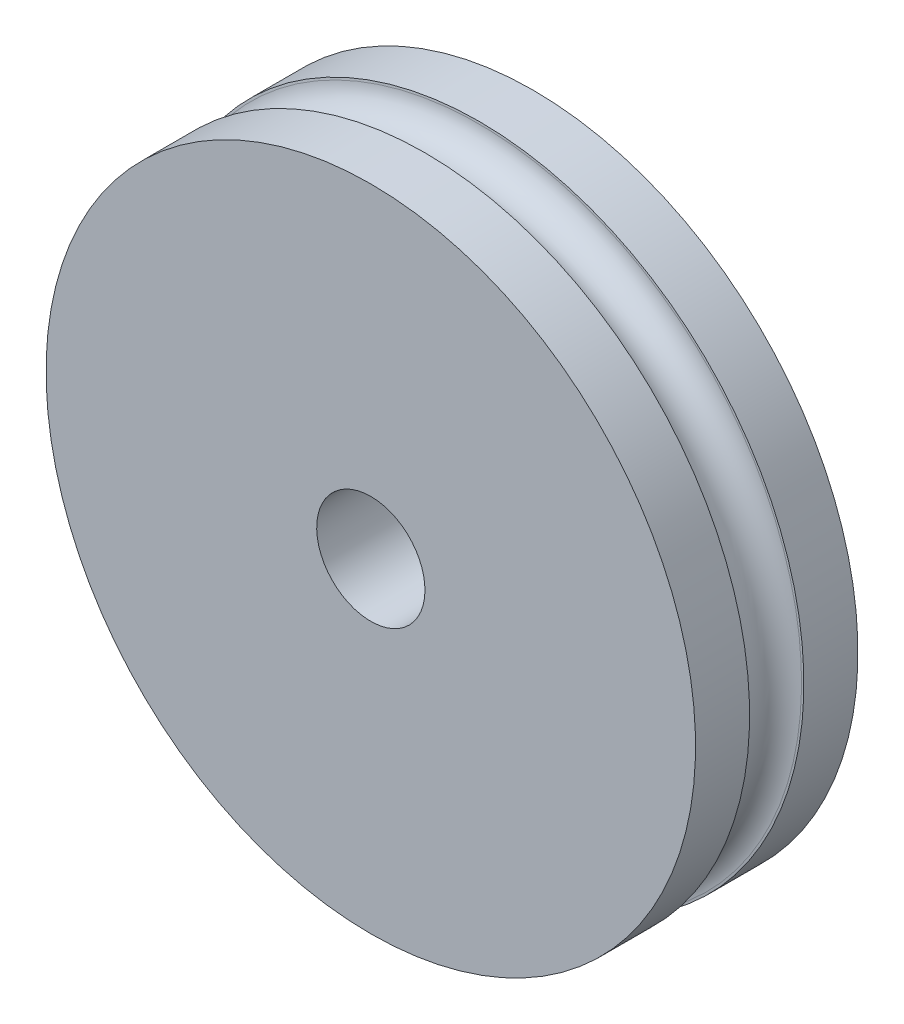
ISO-10303-21;
HEADER;
FILE_DESCRIPTION(('STEP AP214'),'2;1');
FILE_NAME('part.step','',(''),(''),'','','');
FILE_SCHEMA(('AUTOMOTIVE_DESIGN { 1 0 10303 214 1 1 1 1 }'));
ENDSEC;
DATA;
#1=APPLICATION_CONTEXT('core data for automotive mechanical design processes');
#2=APPLICATION_PROTOCOL_DEFINITION('international standard','automotive_design',2000,#1);
#3=PRODUCT_CONTEXT('',#1,'mechanical');
#4=PRODUCT('Part','Part','',(#3));
#5=PRODUCT_RELATED_PRODUCT_CATEGORY('part','',(#4));
#6=PRODUCT_DEFINITION_FORMATION('','',#4);
#7=PRODUCT_DEFINITION_CONTEXT('part definition',#1,'design');
#8=PRODUCT_DEFINITION('design','',#6,#7);
#9=PRODUCT_DEFINITION_SHAPE('','',#8);
#10=(LENGTH_UNIT() NAMED_UNIT(*) SI_UNIT(.MILLI.,.METRE.));
#11=(NAMED_UNIT(*) PLANE_ANGLE_UNIT() SI_UNIT($,.RADIAN.));
#12=(NAMED_UNIT(*) SI_UNIT($,.STERADIAN.) SOLID_ANGLE_UNIT());
#13=UNCERTAINTY_MEASURE_WITH_UNIT(LENGTH_MEASURE(1.E-05),#10,'distance_accuracy_value','');
#14=(GEOMETRIC_REPRESENTATION_CONTEXT(3) GLOBAL_UNCERTAINTY_ASSIGNED_CONTEXT((#13)) GLOBAL_UNIT_ASSIGNED_CONTEXT((#10,
#11,#12)) REPRESENTATION_CONTEXT('',''));
#15=CARTESIAN_POINT('',(0.,0.,0.));
#16=DIRECTION('',(0.,0.,1.));
#17=DIRECTION('',(1.,0.,0.));
#18=AXIS2_PLACEMENT_3D('',#15,#16,#17);
#19=CARTESIAN_POINT('',(0.,19.05,-4.7625));
#20=DIRECTION('',(0.,0.,1.));
#21=DIRECTION('',(0.,-1.,0.));
#22=AXIS2_PLACEMENT_3D('',#19,#20,#21);
#23=PLANE('',#22);
#24=CARTESIAN_POINT('',(0.,0.,-4.7625));
#25=DIRECTION('',(0.,0.,-1.));
#26=DIRECTION('',(0.,1.,0.));
#27=AXIS2_PLACEMENT_3D('',#24,#25,#26);
#28=CIRCLE('',#27,3.175);
#29=CARTESIAN_POINT('',(0.,3.175,-4.7625));
#30=VERTEX_POINT('',#29);
#31=EDGE_CURVE('E60',#30,#30,#28,.T.);
#32=ORIENTED_EDGE('',*,*,#31,.F.);
#33=EDGE_LOOP('',(#32));
#34=FACE_BOUND('',#33,.T.);
#35=CARTESIAN_POINT('',(0.,0.,-4.7625));
#36=DIRECTION('',(0.,0.,1.));
#37=DIRECTION('',(0.,-1.,0.));
#38=AXIS2_PLACEMENT_3D('',#35,#36,#37);
#39=CIRCLE('',#38,19.05);
#40=CARTESIAN_POINT('',(0.,-19.05,-4.7625));
#41=VERTEX_POINT('',#40);
#42=EDGE_CURVE('E10',#41,#41,#39,.T.);
#43=ORIENTED_EDGE('',*,*,#42,.F.);
#44=EDGE_LOOP('',(#43));
#45=FACE_BOUND('',#44,.T.);
#46=ADVANCED_FACE('F34',(#34,#45),#23,.F.);
#47=CARTESIAN_POINT('',(0.,0.,4.7625));
#48=DIRECTION('',(0.,0.,1.));
#49=DIRECTION('',(0.,-1.,0.));
#50=AXIS2_PLACEMENT_3D('',#47,#48,#49);
#51=CYLINDRICAL_SURFACE('',#50,19.05);
#52=CARTESIAN_POINT('',(0.,0.,-1.59245288607328));
#53=DIRECTION('',(0.,0.,1.));
#54=DIRECTION('',(0.,-1.,0.));
#55=AXIS2_PLACEMENT_3D('',#52,#53,#54);
#56=CIRCLE('',#55,19.05);
#57=CARTESIAN_POINT('',(0.,-19.05,-1.59245288607328));
#58=VERTEX_POINT('',#57);
#59=EDGE_CURVE('E40',#58,#58,#56,.T.);
#60=ORIENTED_EDGE('',*,*,#59,.F.);
#61=EDGE_LOOP('',(#60));
#62=FACE_BOUND('',#61,.T.);
#63=ORIENTED_EDGE('',*,*,#42,.T.);
#64=EDGE_LOOP('',(#63));
#65=FACE_BOUND('',#64,.T.);
#66=ADVANCED_FACE('F77',(#62,#65),#51,.T.);
#67=CARTESIAN_POINT('',(0.,0.,-1.59245288607328));
#68=DIRECTION('',(0.,0.,-1.));
#69=DIRECTION('',(0.,1.,0.));
#70=AXIS2_PLACEMENT_3D('',#67,#68,#69);
#71=CONICAL_SURFACE('',#70,19.05,1.48352986419523);
#72=CARTESIAN_POINT('',(0.,0.,-1.58145908322065));
#73=DIRECTION('',(0.,0.,1.));
#74=DIRECTION('',(0.,-1.,0.));
#75=AXIS2_PLACEMENT_3D('',#72,#73,#74);
#76=CIRCLE('',#75,18.9243402583881);
#77=CARTESIAN_POINT('',(0.,-18.9243402583881,-1.58145908322065));
#78=VERTEX_POINT('',#77);
#79=EDGE_CURVE('E44',#78,#78,#76,.T.);
#80=ORIENTED_EDGE('',*,*,#79,.F.);
#81=EDGE_LOOP('',(#80));
#82=FACE_BOUND('',#81,.T.);
#83=ORIENTED_EDGE('',*,*,#59,.T.);
#84=EDGE_LOOP('',(#83));
#85=FACE_BOUND('',#84,.T.);
#86=ADVANCED_FACE('F81',(#82,#85),#71,.T.);
#87=CARTESIAN_POINT('',(0.,0.,0.));
#88=DIRECTION('',(0.,0.,1.));
#89=DIRECTION('',(0.,-1.,0.));
#90=AXIS2_PLACEMENT_3D('',#87,#88,#89);
#91=TOROIDAL_SURFACE('',#90,19.0627,1.5875);
#92=CARTESIAN_POINT('',(0.,0.,1.58145908322065));
#93=DIRECTION('',(0.,0.,1.));
#94=DIRECTION('',(0.,-1.,0.));
#95=AXIS2_PLACEMENT_3D('',#92,#93,#94);
#96=CIRCLE('',#95,18.9243402583881);
#97=CARTESIAN_POINT('',(0.,-18.9243402583881,1.58145908322064));
#98=VERTEX_POINT('',#97);
#99=EDGE_CURVE('E48',#98,#98,#96,.T.);
#100=ORIENTED_EDGE('',*,*,#99,.F.);
#101=EDGE_LOOP('',(#100));
#102=FACE_BOUND('',#101,.T.);
#103=ORIENTED_EDGE('',*,*,#79,.T.);
#104=EDGE_LOOP('',(#103));
#105=FACE_BOUND('',#104,.T.);
#106=ADVANCED_FACE('F86',(#102,#105),#91,.F.);
#107=CARTESIAN_POINT('',(0.,0.,1.58145908322065));
#108=DIRECTION('',(0.,0.,1.));
#109=DIRECTION('',(0.,-1.,0.));
#110=AXIS2_PLACEMENT_3D('',#107,#108,#109);
#111=CONICAL_SURFACE('',#110,18.9243402583881,1.48352986419518);
#112=CARTESIAN_POINT('',(0.,0.,1.59245288607328));
#113=DIRECTION('',(0.,0.,1.));
#114=DIRECTION('',(0.,-1.,0.));
#115=AXIS2_PLACEMENT_3D('',#112,#113,#114);
#116=CIRCLE('',#115,19.05);
#117=CARTESIAN_POINT('',(0.,-19.05,1.59245288607328));
#118=VERTEX_POINT('',#117);
#119=EDGE_CURVE('E53',#118,#118,#116,.T.);
#120=ORIENTED_EDGE('',*,*,#119,.F.);
#121=EDGE_LOOP('',(#120));
#122=FACE_BOUND('',#121,.T.);
#123=ORIENTED_EDGE('',*,*,#99,.T.);
#124=EDGE_LOOP('',(#123));
#125=FACE_BOUND('',#124,.T.);
#126=ADVANCED_FACE('F92',(#122,#125),#111,.T.);
#127=CARTESIAN_POINT('',(0.,0.,4.7625));
#128=DIRECTION('',(0.,0.,1.));
#129=DIRECTION('',(0.,-1.,0.));
#130=AXIS2_PLACEMENT_3D('',#127,#128,#129);
#131=CYLINDRICAL_SURFACE('',#130,19.05);
#132=CARTESIAN_POINT('',(0.,0.,4.7625));
#133=DIRECTION('',(0.,0.,1.));
#134=DIRECTION('',(0.,-1.,0.));
#135=AXIS2_PLACEMENT_3D('',#132,#133,#134);
#136=CIRCLE('',#135,19.05);
#137=CARTESIAN_POINT('',(0.,-19.05,4.7625));
#138=VERTEX_POINT('',#137);
#139=EDGE_CURVE('E56',#138,#138,#136,.T.);
#140=ORIENTED_EDGE('',*,*,#139,.F.);
#141=EDGE_LOOP('',(#140));
#142=FACE_BOUND('',#141,.T.);
#143=ORIENTED_EDGE('',*,*,#119,.T.);
#144=EDGE_LOOP('',(#143));
#145=FACE_BOUND('',#144,.T.);
#146=ADVANCED_FACE('F96',(#142,#145),#131,.T.);
#147=CARTESIAN_POINT('',(0.,0.,4.7625));
#148=DIRECTION('',(0.,0.,-1.));
#149=DIRECTION('',(0.,1.,0.));
#150=AXIS2_PLACEMENT_3D('',#147,#148,#149);
#151=PLANE('',#150);
#152=CARTESIAN_POINT('',(0.,0.,4.7625));
#153=DIRECTION('',(0.,0.,-1.));
#154=DIRECTION('',(0.,1.,0.));
#155=AXIS2_PLACEMENT_3D('',#152,#153,#154);
#156=CIRCLE('',#155,3.175);
#157=CARTESIAN_POINT('',(0.,3.175,4.7625));
#158=VERTEX_POINT('',#157);
#159=EDGE_CURVE('E59',#158,#158,#156,.T.);
#160=ORIENTED_EDGE('',*,*,#159,.T.);
#161=EDGE_LOOP('',(#160));
#162=FACE_BOUND('',#161,.T.);
#163=ORIENTED_EDGE('',*,*,#139,.T.);
#164=EDGE_LOOP('',(#163));
#165=FACE_BOUND('',#164,.T.);
#166=ADVANCED_FACE('F66',(#162,#165),#151,.F.);
#167=CARTESIAN_POINT('',(0.,0.,4.7625));
#168=DIRECTION('',(0.,0.,-1.));
#169=DIRECTION('',(0.,1.,0.));
#170=AXIS2_PLACEMENT_3D('',#167,#168,#169);
#171=CYLINDRICAL_SURFACE('',#170,3.175);
#172=ORIENTED_EDGE('',*,*,#159,.F.);
#173=EDGE_LOOP('',(#172));
#174=FACE_BOUND('',#173,.T.);
#175=ORIENTED_EDGE('',*,*,#31,.T.);
#176=EDGE_LOOP('',(#175));
#177=FACE_BOUND('',#176,.T.);
#178=ADVANCED_FACE('F69',(#174,#177),#171,.F.);
#179=CLOSED_SHELL('',(#46,#66,#86,#106,#126,#146,#166,#178));
#180=MANIFOLD_SOLID_BREP('B2',#179);
#181=ADVANCED_BREP_SHAPE_REPRESENTATION('',(#18,#180),#14);
#182=SHAPE_DEFINITION_REPRESENTATION(#9,#181);
ENDSEC;
END-ISO-10303-21;
